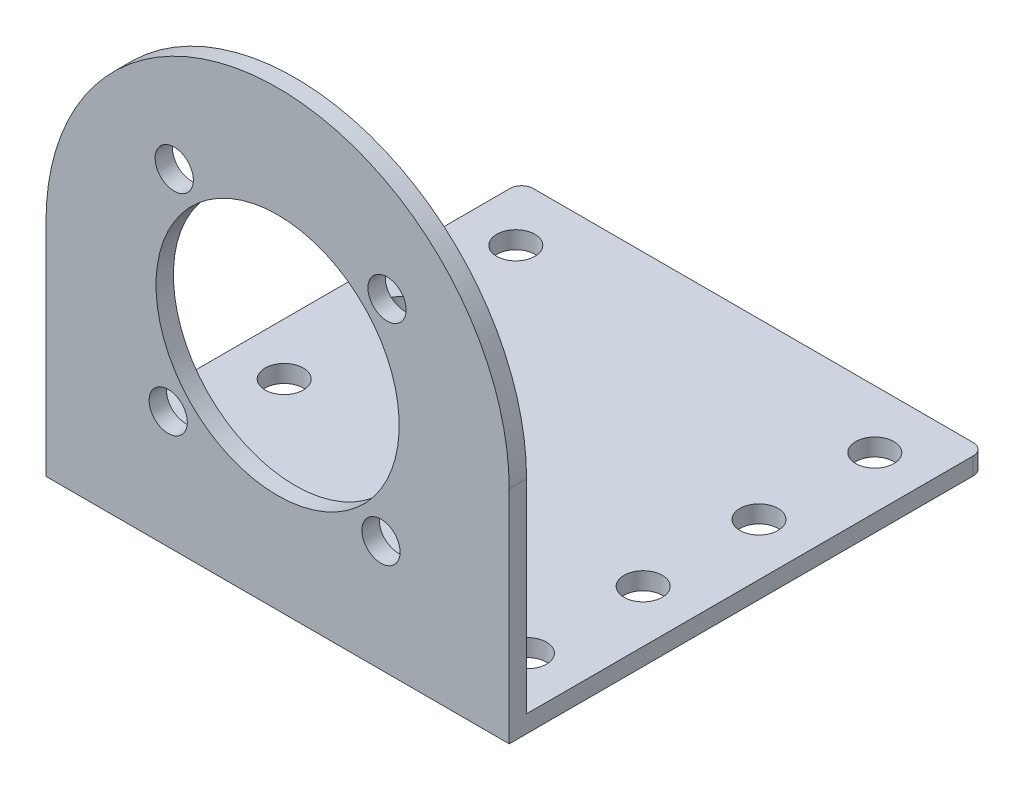
ISO-10303-21;
HEADER;
FILE_DESCRIPTION(('STEP AP214'),'2;1');
FILE_NAME('part.step','',(''),(''),'','','');
FILE_SCHEMA(('AUTOMOTIVE_DESIGN { 1 0 10303 214 1 1 1 1 }'));
ENDSEC;
DATA;
#1=APPLICATION_CONTEXT('core data for automotive mechanical design processes');
#2=APPLICATION_PROTOCOL_DEFINITION('international standard','automotive_design',2000,#1);
#3=PRODUCT_CONTEXT('',#1,'mechanical');
#4=PRODUCT('Part','Part','',(#3));
#5=PRODUCT_RELATED_PRODUCT_CATEGORY('part','',(#4));
#6=PRODUCT_DEFINITION_FORMATION('','',#4);
#7=PRODUCT_DEFINITION_CONTEXT('part definition',#1,'design');
#8=PRODUCT_DEFINITION('design','',#6,#7);
#9=PRODUCT_DEFINITION_SHAPE('','',#8);
#10=(LENGTH_UNIT() NAMED_UNIT(*) SI_UNIT(.MILLI.,.METRE.));
#11=(NAMED_UNIT(*) PLANE_ANGLE_UNIT() SI_UNIT($,.RADIAN.));
#12=(NAMED_UNIT(*) SI_UNIT($,.STERADIAN.) SOLID_ANGLE_UNIT());
#13=UNCERTAINTY_MEASURE_WITH_UNIT(LENGTH_MEASURE(1.E-05),#10,'distance_accuracy_value','');
#14=(GEOMETRIC_REPRESENTATION_CONTEXT(3) GLOBAL_UNCERTAINTY_ASSIGNED_CONTEXT((#13)) GLOBAL_UNIT_ASSIGNED_CONTEXT((#10,
#11,#12)) REPRESENTATION_CONTEXT('',''));
#15=CARTESIAN_POINT('',(0.,0.,0.));
#16=DIRECTION('',(0.,0.,1.));
#17=DIRECTION('',(1.,0.,0.));
#18=AXIS2_PLACEMENT_3D('',#15,#16,#17);
#19=CARTESIAN_POINT('',(40.,36.5355172413793,36.8894084655198));
#20=DIRECTION('',(0.,0.,-1.));
#21=DIRECTION('',(0.,1.,0.));
#22=AXIS2_PLACEMENT_3D('',#19,#20,#21);
#23=PLANE('',#22);
#24=CARTESIAN_POINT('',(29.4484356477115,25.4645185187369,36.8894084655198));
#25=DIRECTION('',(0.,0.,-1.));
#26=DIRECTION('',(0.,1.,0.));
#27=AXIS2_PLACEMENT_3D('',#24,#25,#26);
#28=CIRCLE('',#27,1.65000000000001);
#29=CARTESIAN_POINT('',(29.4484356477115,27.1145185187369,36.8894084655198));
#30=VERTEX_POINT('',#29);
#31=EDGE_CURVE('E643',#30,#30,#28,.T.);
#32=ORIENTED_EDGE('',*,*,#31,.T.);
#33=EDGE_LOOP('',(#32));
#34=FACE_BOUND('',#33,.T.);
#35=CARTESIAN_POINT('',(11.0709987226423,25.9839528890908,36.8894084655198));
#36=DIRECTION('',(0.,0.,-1.));
#37=DIRECTION('',(0.,1.,0.));
#38=AXIS2_PLACEMENT_3D('',#35,#36,#37);
#39=CIRCLE('',#38,1.65);
#40=CARTESIAN_POINT('',(11.0709987226423,27.6339528890908,36.8894084655198));
#41=VERTEX_POINT('',#40);
#42=EDGE_CURVE('E227',#41,#41,#39,.T.);
#43=ORIENTED_EDGE('',*,*,#42,.T.);
#44=EDGE_LOOP('',(#43));
#45=FACE_BOUND('',#44,.T.);
#46=CARTESIAN_POINT('',(10.5515643522885,7.6065159640216,36.8894084655199));
#47=DIRECTION('',(0.,0.,-1.));
#48=DIRECTION('',(0.,1.,0.));
#49=AXIS2_PLACEMENT_3D('',#46,#47,#48);
#50=CIRCLE('',#49,1.64999999999999);
#51=CARTESIAN_POINT('',(10.5515643522885,9.25651596402158,36.8894084655199));
#52=VERTEX_POINT('',#51);
#53=EDGE_CURVE('E299',#52,#52,#50,.T.);
#54=ORIENTED_EDGE('',*,*,#53,.T.);
#55=EDGE_LOOP('',(#54));
#56=FACE_BOUND('',#55,.T.);
#57=CARTESIAN_POINT('',(28.9290012773576,7.08708159366776,36.8894084655199));
#58=DIRECTION('',(0.,0.,-1.));
#59=DIRECTION('',(0.,1.,0.));
#60=AXIS2_PLACEMENT_3D('',#57,#58,#59);
#61=CIRCLE('',#60,1.64999999999999);
#62=CARTESIAN_POINT('',(28.9290012773576,8.73708159366775,36.8894084655199));
#63=VERTEX_POINT('',#62);
#64=EDGE_CURVE('E308',#63,#63,#61,.T.);
#65=ORIENTED_EDGE('',*,*,#64,.T.);
#66=EDGE_LOOP('',(#65));
#67=FACE_BOUND('',#66,.T.);
#68=CARTESIAN_POINT('',(20.,16.5355172413793,36.8894084655199));
#69=DIRECTION('',(0.,0.,-1.));
#70=DIRECTION('',(0.,1.,0.));
#71=AXIS2_PLACEMENT_3D('',#68,#69,#70);
#72=CIRCLE('',#71,10.5);
#73=CARTESIAN_POINT('',(20.,27.0355172413793,36.8894084655199));
#74=VERTEX_POINT('',#73);
#75=EDGE_CURVE('E314',#74,#74,#72,.T.);
#76=ORIENTED_EDGE('',*,*,#75,.T.);
#77=EDGE_LOOP('',(#76));
#78=FACE_BOUND('',#77,.T.);
#79=CARTESIAN_POINT('',(20.,16.5355172413793,36.8894084655199));
#80=DIRECTION('',(0.,0.,-1.));
#81=DIRECTION('',(0.,1.,0.));
#82=AXIS2_PLACEMENT_3D('',#79,#80,#81);
#83=CIRCLE('',#82,20.);
#84=CARTESIAN_POINT('',(40.,16.5355172413793,36.8894084655199));
#85=VERTEX_POINT('',#84);
#86=CARTESIAN_POINT('',(0.,16.5355172413793,36.8894084655199));
#87=VERTEX_POINT('',#86);
#88=EDGE_CURVE('E226',#85,#87,#83,.F.);
#89=ORIENTED_EDGE('',*,*,#88,.T.);
#90=DIRECTION('',(0.,-1.,0.));
#91=VECTOR('',#90,1.);
#92=CARTESIAN_POINT('',(0.,36.5355172413793,36.8894084655198));
#93=LINE('',#92,#91);
#94=CARTESIAN_POINT('',(0.,-2.53448275862069,36.8894084655199));
#95=VERTEX_POINT('',#94);
#96=EDGE_CURVE('E232',#87,#95,#93,.T.);
#97=ORIENTED_EDGE('',*,*,#96,.T.);
#98=DIRECTION('',(-1.,0.,0.));
#99=VECTOR('',#98,1.);
#100=CARTESIAN_POINT('',(40.,-2.53448275862069,36.8894084655199));
#101=LINE('',#100,#99);
#102=CARTESIAN_POINT('',(40.,-2.53448275862069,36.8894084655199));
#103=VERTEX_POINT('',#102);
#104=EDGE_CURVE('E247',#103,#95,#101,.T.);
#105=ORIENTED_EDGE('',*,*,#104,.F.);
#106=DIRECTION('',(0.,-1.,0.));
#107=VECTOR('',#106,1.);
#108=CARTESIAN_POINT('',(40.,36.5355172413793,36.8894084655198));
#109=LINE('',#108,#107);
#110=EDGE_CURVE('E239',#85,#103,#109,.T.);
#111=ORIENTED_EDGE('',*,*,#110,.F.);
#112=EDGE_LOOP('',(#89,#97,#105,#111));
#113=FACE_BOUND('',#112,.T.);
#114=ADVANCED_FACE('F147',(#34,#45,#56,#67,#78,#113),#23,.F.);
#115=CARTESIAN_POINT('',(40.,36.5355172413793,35.3894084655198));
#116=DIRECTION('',(0.,0.,-1.));
#117=DIRECTION('',(0.,1.,0.));
#118=AXIS2_PLACEMENT_3D('',#115,#116,#117);
#119=PLANE('',#118);
#120=CARTESIAN_POINT('',(29.4484356477115,25.4645185187369,35.3894084655198));
#121=DIRECTION('',(0.,0.,-1.));
#122=DIRECTION('',(0.,1.,0.));
#123=AXIS2_PLACEMENT_3D('',#120,#121,#122);
#124=CIRCLE('',#123,1.65000000000001);
#125=CARTESIAN_POINT('',(29.4484356477115,27.1145185187369,35.3894084655198));
#126=VERTEX_POINT('',#125);
#127=EDGE_CURVE('E641',#126,#126,#124,.T.);
#128=ORIENTED_EDGE('',*,*,#127,.F.);
#129=EDGE_LOOP('',(#128));
#130=FACE_BOUND('',#129,.T.);
#131=CARTESIAN_POINT('',(11.0709987226423,25.9839528890908,35.3894084655198));
#132=DIRECTION('',(0.,0.,-1.));
#133=DIRECTION('',(0.,1.,0.));
#134=AXIS2_PLACEMENT_3D('',#131,#132,#133);
#135=CIRCLE('',#134,1.65);
#136=CARTESIAN_POINT('',(11.0709987226423,27.6339528890908,35.3894084655198));
#137=VERTEX_POINT('',#136);
#138=EDGE_CURVE('E644',#137,#137,#135,.T.);
#139=ORIENTED_EDGE('',*,*,#138,.F.);
#140=EDGE_LOOP('',(#139));
#141=FACE_BOUND('',#140,.T.);
#142=CARTESIAN_POINT('',(10.5515643522885,7.6065159640216,35.3894084655198));
#143=DIRECTION('',(0.,0.,-1.));
#144=DIRECTION('',(0.,1.,0.));
#145=AXIS2_PLACEMENT_3D('',#142,#143,#144);
#146=CIRCLE('',#145,1.64999999999999);
#147=CARTESIAN_POINT('',(10.5515643522885,9.25651596402158,35.3894084655198));
#148=VERTEX_POINT('',#147);
#149=EDGE_CURVE('E296',#148,#148,#146,.T.);
#150=ORIENTED_EDGE('',*,*,#149,.F.);
#151=EDGE_LOOP('',(#150));
#152=FACE_BOUND('',#151,.T.);
#153=CARTESIAN_POINT('',(28.9290012773576,7.08708159366776,35.3894084655198));
#154=DIRECTION('',(0.,0.,-1.));
#155=DIRECTION('',(0.,1.,0.));
#156=AXIS2_PLACEMENT_3D('',#153,#154,#155);
#157=CIRCLE('',#156,1.64999999999999);
#158=CARTESIAN_POINT('',(28.9290012773576,8.73708159366775,35.3894084655198));
#159=VERTEX_POINT('',#158);
#160=EDGE_CURVE('E305',#159,#159,#157,.T.);
#161=ORIENTED_EDGE('',*,*,#160,.F.);
#162=EDGE_LOOP('',(#161));
#163=FACE_BOUND('',#162,.T.);
#164=CARTESIAN_POINT('',(20.,16.5355172413793,35.3894084655198));
#165=DIRECTION('',(0.,0.,-1.));
#166=DIRECTION('',(0.,1.,0.));
#167=AXIS2_PLACEMENT_3D('',#164,#165,#166);
#168=CIRCLE('',#167,10.5);
#169=CARTESIAN_POINT('',(20.,27.0355172413793,35.3894084655198));
#170=VERTEX_POINT('',#169);
#171=EDGE_CURVE('E311',#170,#170,#168,.T.);
#172=ORIENTED_EDGE('',*,*,#171,.F.);
#173=EDGE_LOOP('',(#172));
#174=FACE_BOUND('',#173,.T.);
#175=DIRECTION('',(0.,-1.,0.));
#176=VECTOR('',#175,1.);
#177=CARTESIAN_POINT('',(0.,36.5355172413793,35.3894084655198));
#178=LINE('',#177,#176);
#179=CARTESIAN_POINT('',(0.,16.5355172413793,35.3894084655198));
#180=VERTEX_POINT('',#179);
#181=CARTESIAN_POINT('',(0.,-1.03448275862069,35.3894084655198));
#182=VERTEX_POINT('',#181);
#183=EDGE_CURVE('E230',#180,#182,#178,.T.);
#184=ORIENTED_EDGE('',*,*,#183,.F.);
#185=CARTESIAN_POINT('',(20.,16.5355172413793,35.3894084655198));
#186=DIRECTION('',(0.,0.,-1.));
#187=DIRECTION('',(0.,1.,0.));
#188=AXIS2_PLACEMENT_3D('',#185,#186,#187);
#189=CIRCLE('',#188,20.);
#190=CARTESIAN_POINT('',(40.,16.5355172413793,35.3894084655198));
#191=VERTEX_POINT('',#190);
#192=EDGE_CURVE('E216',#191,#180,#189,.F.);
#193=ORIENTED_EDGE('',*,*,#192,.F.);
#194=DIRECTION('',(0.,-1.,0.));
#195=VECTOR('',#194,1.);
#196=CARTESIAN_POINT('',(40.,36.5355172413793,35.3894084655198));
#197=LINE('',#196,#195);
#198=CARTESIAN_POINT('',(40.,-1.03448275862069,35.3894084655198));
#199=VERTEX_POINT('',#198);
#200=EDGE_CURVE('E250',#191,#199,#197,.T.);
#201=ORIENTED_EDGE('',*,*,#200,.T.);
#202=DIRECTION('',(1.,0.,0.));
#203=VECTOR('',#202,1.);
#204=CARTESIAN_POINT('',(40.,-1.03448275862069,35.3894084655198));
#205=LINE('',#204,#203);
#206=EDGE_CURVE('E237',#182,#199,#205,.T.);
#207=ORIENTED_EDGE('',*,*,#206,.F.);
#208=EDGE_LOOP('',(#184,#193,#201,#207));
#209=FACE_BOUND('',#208,.T.);
#210=ADVANCED_FACE('F235',(#130,#141,#152,#163,#174,#209),#119,.T.);
#211=CARTESIAN_POINT('',(0.,0.,0.));
#212=DIRECTION('',(1.,0.,0.));
#213=DIRECTION('',(0.,0.,-1.));
#214=AXIS2_PLACEMENT_3D('',#211,#212,#213);
#215=PLANE('',#214);
#216=DIRECTION('',(0.,0.,-1.));
#217=VECTOR('',#216,1.);
#218=CARTESIAN_POINT('',(0.,-1.03448275862069,36.8894084655199));
#219=LINE('',#218,#217);
#220=CARTESIAN_POINT('',(0.,-1.03448275862069,-3.17959153448014));
#221=VERTEX_POINT('',#220);
#222=EDGE_CURVE('E255',#182,#221,#219,.T.);
#223=ORIENTED_EDGE('',*,*,#222,.T.);
#224=DIRECTION('',(0.,1.,0.));
#225=VECTOR('',#224,1.);
#226=CARTESIAN_POINT('',(0.,0.,-3.17959153448014));
#227=LINE('',#226,#225);
#228=CARTESIAN_POINT('',(0.,-2.53448275862069,-3.17959153448014));
#229=VERTEX_POINT('',#228);
#230=EDGE_CURVE('E170',#221,#229,#227,.F.);
#231=ORIENTED_EDGE('',*,*,#230,.T.);
#232=DIRECTION('',(0.,0.,-1.));
#233=VECTOR('',#232,1.);
#234=CARTESIAN_POINT('',(0.,-2.53448275862069,36.8894084655199));
#235=LINE('',#234,#233);
#236=EDGE_CURVE('E240',#95,#229,#235,.T.);
#237=ORIENTED_EDGE('',*,*,#236,.F.);
#238=ORIENTED_EDGE('',*,*,#96,.F.);
#239=DIRECTION('',(0.,0.,-1.));
#240=VECTOR('',#239,1.);
#241=CARTESIAN_POINT('',(0.,16.5355172413793,75.3894084655198));
#242=LINE('',#241,#240);
#243=EDGE_CURVE('E219',#180,#87,#242,.F.);
#244=ORIENTED_EDGE('',*,*,#243,.F.);
#245=ORIENTED_EDGE('',*,*,#183,.T.);
#246=EDGE_LOOP('',(#223,#231,#237,#238,#244,#245));
#247=FACE_BOUND('',#246,.T.);
#248=ADVANCED_FACE('F229',(#247),#215,.F.);
#249=CARTESIAN_POINT('',(40.,0.,0.));
#250=DIRECTION('',(1.,0.,0.));
#251=DIRECTION('',(0.,0.,-1.));
#252=AXIS2_PLACEMENT_3D('',#249,#250,#251);
#253=PLANE('',#252);
#254=DIRECTION('',(0.,0.,-1.));
#255=VECTOR('',#254,1.);
#256=CARTESIAN_POINT('',(40.,-2.53448275862069,36.8894084655199));
#257=LINE('',#256,#255);
#258=CARTESIAN_POINT('',(40.,-2.53448275862069,-3.17959153448014));
#259=VERTEX_POINT('',#258);
#260=EDGE_CURVE('E242',#103,#259,#257,.T.);
#261=ORIENTED_EDGE('',*,*,#260,.T.);
#262=DIRECTION('',(0.,1.,0.));
#263=VECTOR('',#262,1.);
#264=CARTESIAN_POINT('',(40.,-1.03448275862069,-3.17959153448014));
#265=LINE('',#264,#263);
#266=CARTESIAN_POINT('',(40.,-1.03448275862069,-3.17959153448014));
#267=VERTEX_POINT('',#266);
#268=EDGE_CURVE('E12',#259,#267,#265,.T.);
#269=ORIENTED_EDGE('',*,*,#268,.T.);
#270=DIRECTION('',(0.,0.,-1.));
#271=VECTOR('',#270,1.);
#272=CARTESIAN_POINT('',(40.,-1.03448275862069,36.8894084655199));
#273=LINE('',#272,#271);
#274=EDGE_CURVE('E251',#199,#267,#273,.T.);
#275=ORIENTED_EDGE('',*,*,#274,.F.);
#276=ORIENTED_EDGE('',*,*,#200,.F.);
#277=DIRECTION('',(0.,0.,-1.));
#278=VECTOR('',#277,1.);
#279=CARTESIAN_POINT('',(40.,16.5355172413793,75.3894084655198));
#280=LINE('',#279,#278);
#281=EDGE_CURVE('E222',#191,#85,#280,.F.);
#282=ORIENTED_EDGE('',*,*,#281,.T.);
#283=ORIENTED_EDGE('',*,*,#110,.T.);
#284=EDGE_LOOP('',(#261,#269,#275,#276,#282,#283));
#285=FACE_BOUND('',#284,.T.);
#286=ADVANCED_FACE('F289',(#285),#253,.T.);
#287=CARTESIAN_POINT('',(40.,-2.53448275862069,36.8894084655199));
#288=DIRECTION('',(0.,1.,0.));
#289=DIRECTION('',(0.,0.,1.));
#290=AXIS2_PLACEMENT_3D('',#287,#288,#289);
#291=PLANE('',#290);
#292=CARTESIAN_POINT('',(35.5,-2.53448275862069,0.820408465519859));
#293=DIRECTION('',(0.,1.,0.));
#294=DIRECTION('',(0.,0.,1.));
#295=AXIS2_PLACEMENT_3D('',#292,#293,#294);
#296=CIRCLE('',#295,1.65);
#297=CARTESIAN_POINT('',(35.5,-2.53448275862069,2.47040846551986));
#298=VERTEX_POINT('',#297);
#299=EDGE_CURVE('E320',#298,#298,#296,.T.);
#300=ORIENTED_EDGE('',*,*,#299,.T.);
#301=EDGE_LOOP('',(#300));
#302=FACE_BOUND('',#301,.T.);
#303=CARTESIAN_POINT('',(35.5,-2.53448275862069,10.8204084655199));
#304=DIRECTION('',(0.,1.,0.));
#305=DIRECTION('',(0.,0.,1.));
#306=AXIS2_PLACEMENT_3D('',#303,#304,#305);
#307=CIRCLE('',#306,1.65);
#308=CARTESIAN_POINT('',(35.5,-2.53448275862069,12.4704084655199));
#309=VERTEX_POINT('',#308);
#310=EDGE_CURVE('E326',#309,#309,#307,.T.);
#311=ORIENTED_EDGE('',*,*,#310,.T.);
#312=EDGE_LOOP('',(#311));
#313=FACE_BOUND('',#312,.T.);
#314=CARTESIAN_POINT('',(35.5,-2.53448275862069,20.8204084655199));
#315=DIRECTION('',(0.,1.,0.));
#316=DIRECTION('',(0.,0.,1.));
#317=AXIS2_PLACEMENT_3D('',#314,#315,#316);
#318=CIRCLE('',#317,1.65);
#319=CARTESIAN_POINT('',(35.5,-2.53448275862069,22.4704084655199));
#320=VERTEX_POINT('',#319);
#321=EDGE_CURVE('E332',#320,#320,#318,.T.);
#322=ORIENTED_EDGE('',*,*,#321,.T.);
#323=EDGE_LOOP('',(#322));
#324=FACE_BOUND('',#323,.T.);
#325=CARTESIAN_POINT('',(35.5,-2.53448275862069,30.8204084655199));
#326=DIRECTION('',(0.,1.,0.));
#327=DIRECTION('',(0.,0.,1.));
#328=AXIS2_PLACEMENT_3D('',#325,#326,#327);
#329=CIRCLE('',#328,1.65);
#330=CARTESIAN_POINT('',(35.5,-2.53448275862069,32.4704084655199));
#331=VERTEX_POINT('',#330);
#332=EDGE_CURVE('E338',#331,#331,#329,.T.);
#333=ORIENTED_EDGE('',*,*,#332,.T.);
#334=EDGE_LOOP('',(#333));
#335=FACE_BOUND('',#334,.T.);
#336=CARTESIAN_POINT('',(4.5,-2.53448275862069,0.820408465519859));
#337=DIRECTION('',(0.,1.,0.));
#338=DIRECTION('',(0.,0.,1.));
#339=AXIS2_PLACEMENT_3D('',#336,#337,#338);
#340=CIRCLE('',#339,1.65);
#341=CARTESIAN_POINT('',(4.5,-2.53448275862069,2.47040846551986));
#342=VERTEX_POINT('',#341);
#343=EDGE_CURVE('E344',#342,#342,#340,.T.);
#344=ORIENTED_EDGE('',*,*,#343,.T.);
#345=EDGE_LOOP('',(#344));
#346=FACE_BOUND('',#345,.T.);
#347=CARTESIAN_POINT('',(4.5,-2.53448275862069,10.8204084655199));
#348=DIRECTION('',(0.,1.,0.));
#349=DIRECTION('',(0.,0.,1.));
#350=AXIS2_PLACEMENT_3D('',#347,#348,#349);
#351=CIRCLE('',#350,1.65);
#352=CARTESIAN_POINT('',(4.5,-2.53448275862069,12.4704084655199));
#353=VERTEX_POINT('',#352);
#354=EDGE_CURVE('E350',#353,#353,#351,.T.);
#355=ORIENTED_EDGE('',*,*,#354,.T.);
#356=EDGE_LOOP('',(#355));
#357=FACE_BOUND('',#356,.T.);
#358=CARTESIAN_POINT('',(4.5,-2.53448275862069,20.8204084655199));
#359=DIRECTION('',(0.,1.,0.));
#360=DIRECTION('',(0.,0.,1.));
#361=AXIS2_PLACEMENT_3D('',#358,#359,#360);
#362=CIRCLE('',#361,1.65);
#363=CARTESIAN_POINT('',(4.5,-2.53448275862069,22.4704084655199));
#364=VERTEX_POINT('',#363);
#365=EDGE_CURVE('E356',#364,#364,#362,.T.);
#366=ORIENTED_EDGE('',*,*,#365,.T.);
#367=EDGE_LOOP('',(#366));
#368=FACE_BOUND('',#367,.T.);
#369=CARTESIAN_POINT('',(4.5,-2.53448275862069,30.8204084655199));
#370=DIRECTION('',(0.,1.,0.));
#371=DIRECTION('',(0.,0.,1.));
#372=AXIS2_PLACEMENT_3D('',#369,#370,#371);
#373=CIRCLE('',#372,1.65);
#374=CARTESIAN_POINT('',(4.5,-2.53448275862069,32.4704084655199));
#375=VERTEX_POINT('',#374);
#376=EDGE_CURVE('E257',#375,#375,#373,.T.);
#377=ORIENTED_EDGE('',*,*,#376,.T.);
#378=EDGE_LOOP('',(#377));
#379=FACE_BOUND('',#378,.T.);
#380=ORIENTED_EDGE('',*,*,#236,.T.);
#381=CARTESIAN_POINT('',(1.,-2.53448275862069,-3.17959153448014));
#382=DIRECTION('',(0.,1.,0.));
#383=DIRECTION('',(0.,0.,1.));
#384=AXIS2_PLACEMENT_3D('',#381,#382,#383);
#385=CIRCLE('',#384,1.);
#386=CARTESIAN_POINT('',(1.,-2.53448275862069,-4.17959153448014));
#387=VERTEX_POINT('',#386);
#388=EDGE_CURVE('E155',#229,#387,#385,.F.);
#389=ORIENTED_EDGE('',*,*,#388,.T.);
#390=DIRECTION('',(-1.,0.,0.));
#391=VECTOR('',#390,1.);
#392=CARTESIAN_POINT('',(40.,-2.53448275862069,-4.17959153448014));
#393=LINE('',#392,#391);
#394=CARTESIAN_POINT('',(39.,-2.53448275862069,-4.17959153448014));
#395=VERTEX_POINT('',#394);
#396=EDGE_CURVE('E258',#395,#387,#393,.T.);
#397=ORIENTED_EDGE('',*,*,#396,.F.);
#398=CARTESIAN_POINT('',(39.,-2.53448275862069,-3.17959153448014));
#399=DIRECTION('',(0.,1.,0.));
#400=DIRECTION('',(0.,0.,1.));
#401=AXIS2_PLACEMENT_3D('',#398,#399,#400);
#402=CIRCLE('',#401,1.);
#403=EDGE_CURVE('E162',#395,#259,#402,.F.);
#404=ORIENTED_EDGE('',*,*,#403,.T.);
#405=ORIENTED_EDGE('',*,*,#260,.F.);
#406=ORIENTED_EDGE('',*,*,#104,.T.);
#407=EDGE_LOOP('',(#380,#389,#397,#404,#405,#406));
#408=FACE_BOUND('',#407,.T.);
#409=ADVANCED_FACE('F275',(#302,#313,#324,#335,#346,#357,#368,#379,#408),#291,.F.);
#410=CARTESIAN_POINT('',(40.,-2.53448275862069,-4.17959153448014));
#411=DIRECTION('',(0.,0.,1.));
#412=DIRECTION('',(1.,0.,0.));
#413=AXIS2_PLACEMENT_3D('',#410,#411,#412);
#414=PLANE('',#413);
#415=ORIENTED_EDGE('',*,*,#396,.T.);
#416=DIRECTION('',(0.,1.,0.));
#417=VECTOR('',#416,1.);
#418=CARTESIAN_POINT('',(1.,-2.53448275862069,-4.17959153448014));
#419=LINE('',#418,#417);
#420=CARTESIAN_POINT('',(1.,-1.03448275862069,-4.17959153448014));
#421=VERTEX_POINT('',#420);
#422=EDGE_CURVE('E266',#387,#421,#419,.T.);
#423=ORIENTED_EDGE('',*,*,#422,.T.);
#424=DIRECTION('',(-1.,0.,0.));
#425=VECTOR('',#424,1.);
#426=CARTESIAN_POINT('',(40.,-1.03448275862069,-4.17959153448014));
#427=LINE('',#426,#425);
#428=CARTESIAN_POINT('',(39.,-1.03448275862069,-4.17959153448014));
#429=VERTEX_POINT('',#428);
#430=EDGE_CURVE('E254',#429,#421,#427,.T.);
#431=ORIENTED_EDGE('',*,*,#430,.F.);
#432=DIRECTION('',(0.,1.,0.));
#433=VECTOR('',#432,1.);
#434=CARTESIAN_POINT('',(39.,-2.53448275862069,-4.17959153448014));
#435=LINE('',#434,#433);
#436=EDGE_CURVE('E233',#429,#395,#435,.F.);
#437=ORIENTED_EDGE('',*,*,#436,.T.);
#438=EDGE_LOOP('',(#415,#423,#431,#437));
#439=FACE_BOUND('',#438,.T.);
#440=ADVANCED_FACE('F279',(#439),#414,.F.);
#441=CARTESIAN_POINT('',(40.,-1.03448275862069,36.8894084655199));
#442=DIRECTION('',(0.,1.,0.));
#443=DIRECTION('',(0.,0.,1.));
#444=AXIS2_PLACEMENT_3D('',#441,#442,#443);
#445=PLANE('',#444);
#446=CARTESIAN_POINT('',(35.5,-1.03448275862069,0.820408465519859));
#447=DIRECTION('',(0.,1.,0.));
#448=DIRECTION('',(0.,0.,1.));
#449=AXIS2_PLACEMENT_3D('',#446,#447,#448);
#450=CIRCLE('',#449,1.65);
#451=CARTESIAN_POINT('',(35.5,-1.03448275862069,2.47040846551986));
#452=VERTEX_POINT('',#451);
#453=EDGE_CURVE('E317',#452,#452,#450,.T.);
#454=ORIENTED_EDGE('',*,*,#453,.F.);
#455=EDGE_LOOP('',(#454));
#456=FACE_BOUND('',#455,.T.);
#457=CARTESIAN_POINT('',(35.5,-1.03448275862069,10.8204084655199));
#458=DIRECTION('',(0.,1.,0.));
#459=DIRECTION('',(0.,0.,1.));
#460=AXIS2_PLACEMENT_3D('',#457,#458,#459);
#461=CIRCLE('',#460,1.65);
#462=CARTESIAN_POINT('',(35.5,-1.03448275862069,12.4704084655199));
#463=VERTEX_POINT('',#462);
#464=EDGE_CURVE('E323',#463,#463,#461,.T.);
#465=ORIENTED_EDGE('',*,*,#464,.F.);
#466=EDGE_LOOP('',(#465));
#467=FACE_BOUND('',#466,.T.);
#468=CARTESIAN_POINT('',(35.5,-1.03448275862069,20.8204084655199));
#469=DIRECTION('',(0.,1.,0.));
#470=DIRECTION('',(0.,0.,1.));
#471=AXIS2_PLACEMENT_3D('',#468,#469,#470);
#472=CIRCLE('',#471,1.65);
#473=CARTESIAN_POINT('',(35.5,-1.03448275862069,22.4704084655199));
#474=VERTEX_POINT('',#473);
#475=EDGE_CURVE('E329',#474,#474,#472,.T.);
#476=ORIENTED_EDGE('',*,*,#475,.F.);
#477=EDGE_LOOP('',(#476));
#478=FACE_BOUND('',#477,.T.);
#479=CARTESIAN_POINT('',(35.5,-1.03448275862069,30.8204084655199));
#480=DIRECTION('',(0.,1.,0.));
#481=DIRECTION('',(0.,0.,1.));
#482=AXIS2_PLACEMENT_3D('',#479,#480,#481);
#483=CIRCLE('',#482,1.65);
#484=CARTESIAN_POINT('',(35.5,-1.03448275862069,32.4704084655199));
#485=VERTEX_POINT('',#484);
#486=EDGE_CURVE('E335',#485,#485,#483,.T.);
#487=ORIENTED_EDGE('',*,*,#486,.F.);
#488=EDGE_LOOP('',(#487));
#489=FACE_BOUND('',#488,.T.);
#490=CARTESIAN_POINT('',(4.5,-1.03448275862069,0.820408465519859));
#491=DIRECTION('',(0.,1.,0.));
#492=DIRECTION('',(0.,0.,1.));
#493=AXIS2_PLACEMENT_3D('',#490,#491,#492);
#494=CIRCLE('',#493,1.65);
#495=CARTESIAN_POINT('',(4.5,-1.03448275862069,2.47040846551986));
#496=VERTEX_POINT('',#495);
#497=EDGE_CURVE('E341',#496,#496,#494,.T.);
#498=ORIENTED_EDGE('',*,*,#497,.F.);
#499=EDGE_LOOP('',(#498));
#500=FACE_BOUND('',#499,.T.);
#501=CARTESIAN_POINT('',(4.5,-1.03448275862069,10.8204084655199));
#502=DIRECTION('',(0.,1.,0.));
#503=DIRECTION('',(0.,0.,1.));
#504=AXIS2_PLACEMENT_3D('',#501,#502,#503);
#505=CIRCLE('',#504,1.65);
#506=CARTESIAN_POINT('',(4.5,-1.03448275862069,12.4704084655199));
#507=VERTEX_POINT('',#506);
#508=EDGE_CURVE('E347',#507,#507,#505,.T.);
#509=ORIENTED_EDGE('',*,*,#508,.F.);
#510=EDGE_LOOP('',(#509));
#511=FACE_BOUND('',#510,.T.);
#512=CARTESIAN_POINT('',(4.5,-1.03448275862069,20.8204084655199));
#513=DIRECTION('',(0.,1.,0.));
#514=DIRECTION('',(0.,0.,1.));
#515=AXIS2_PLACEMENT_3D('',#512,#513,#514);
#516=CIRCLE('',#515,1.65);
#517=CARTESIAN_POINT('',(4.5,-1.03448275862069,22.4704084655199));
#518=VERTEX_POINT('',#517);
#519=EDGE_CURVE('E353',#518,#518,#516,.T.);
#520=ORIENTED_EDGE('',*,*,#519,.F.);
#521=EDGE_LOOP('',(#520));
#522=FACE_BOUND('',#521,.T.);
#523=CARTESIAN_POINT('',(4.5,-1.03448275862069,30.8204084655199));
#524=DIRECTION('',(0.,1.,0.));
#525=DIRECTION('',(0.,0.,1.));
#526=AXIS2_PLACEMENT_3D('',#523,#524,#525);
#527=CIRCLE('',#526,1.65);
#528=CARTESIAN_POINT('',(4.5,-1.03448275862069,32.4704084655199));
#529=VERTEX_POINT('',#528);
#530=EDGE_CURVE('E359',#529,#529,#527,.T.);
#531=ORIENTED_EDGE('',*,*,#530,.F.);
#532=EDGE_LOOP('',(#531));
#533=FACE_BOUND('',#532,.T.);
#534=ORIENTED_EDGE('',*,*,#430,.T.);
#535=CARTESIAN_POINT('',(1.,-1.03448275862069,-3.17959153448014));
#536=DIRECTION('',(0.,1.,0.));
#537=DIRECTION('',(0.,0.,1.));
#538=AXIS2_PLACEMENT_3D('',#535,#536,#537);
#539=CIRCLE('',#538,1.);
#540=EDGE_CURVE('E271',#421,#221,#539,.T.);
#541=ORIENTED_EDGE('',*,*,#540,.T.);
#542=ORIENTED_EDGE('',*,*,#222,.F.);
#543=ORIENTED_EDGE('',*,*,#206,.T.);
#544=ORIENTED_EDGE('',*,*,#274,.T.);
#545=CARTESIAN_POINT('',(39.,-1.03448275862069,-3.17959153448014));
#546=DIRECTION('',(0.,1.,0.));
#547=DIRECTION('',(0.,0.,1.));
#548=AXIS2_PLACEMENT_3D('',#545,#546,#547);
#549=CIRCLE('',#548,1.);
#550=EDGE_CURVE('E269',#267,#429,#549,.T.);
#551=ORIENTED_EDGE('',*,*,#550,.T.);
#552=EDGE_LOOP('',(#534,#541,#542,#543,#544,#551));
#553=FACE_BOUND('',#552,.T.);
#554=ADVANCED_FACE('F284',(#456,#467,#478,#489,#500,#511,#522,#533,#553),#445,.T.);
#555=CARTESIAN_POINT('',(4.5,-41.0344827586207,30.8204084655199));
#556=DIRECTION('',(0.,1.,0.));
#557=DIRECTION('',(0.,0.,1.));
#558=AXIS2_PLACEMENT_3D('',#555,#556,#557);
#559=CYLINDRICAL_SURFACE('',#558,1.65);
#560=ORIENTED_EDGE('',*,*,#530,.T.);
#561=EDGE_LOOP('',(#560));
#562=FACE_BOUND('',#561,.T.);
#563=ORIENTED_EDGE('',*,*,#376,.F.);
#564=EDGE_LOOP('',(#563));
#565=FACE_BOUND('',#564,.T.);
#566=ADVANCED_FACE('F365',(#562,#565),#559,.F.);
#567=CARTESIAN_POINT('',(4.5,-41.0344827586207,20.8204084655199));
#568=DIRECTION('',(0.,1.,0.));
#569=DIRECTION('',(0.,0.,1.));
#570=AXIS2_PLACEMENT_3D('',#567,#568,#569);
#571=CYLINDRICAL_SURFACE('',#570,1.65);
#572=ORIENTED_EDGE('',*,*,#519,.T.);
#573=EDGE_LOOP('',(#572));
#574=FACE_BOUND('',#573,.T.);
#575=ORIENTED_EDGE('',*,*,#365,.F.);
#576=EDGE_LOOP('',(#575));
#577=FACE_BOUND('',#576,.T.);
#578=ADVANCED_FACE('F367',(#574,#577),#571,.F.);
#579=CARTESIAN_POINT('',(4.5,-41.0344827586207,10.8204084655199));
#580=DIRECTION('',(0.,1.,0.));
#581=DIRECTION('',(0.,0.,1.));
#582=AXIS2_PLACEMENT_3D('',#579,#580,#581);
#583=CYLINDRICAL_SURFACE('',#582,1.65);
#584=ORIENTED_EDGE('',*,*,#508,.T.);
#585=EDGE_LOOP('',(#584));
#586=FACE_BOUND('',#585,.T.);
#587=ORIENTED_EDGE('',*,*,#354,.F.);
#588=EDGE_LOOP('',(#587));
#589=FACE_BOUND('',#588,.T.);
#590=ADVANCED_FACE('F374',(#586,#589),#583,.F.);
#591=CARTESIAN_POINT('',(4.5,-41.0344827586207,0.820408465519859));
#592=DIRECTION('',(0.,1.,0.));
#593=DIRECTION('',(0.,0.,1.));
#594=AXIS2_PLACEMENT_3D('',#591,#592,#593);
#595=CYLINDRICAL_SURFACE('',#594,1.65);
#596=ORIENTED_EDGE('',*,*,#497,.T.);
#597=EDGE_LOOP('',(#596));
#598=FACE_BOUND('',#597,.T.);
#599=ORIENTED_EDGE('',*,*,#343,.F.);
#600=EDGE_LOOP('',(#599));
#601=FACE_BOUND('',#600,.T.);
#602=ADVANCED_FACE('F439',(#598,#601),#595,.F.);
#603=CARTESIAN_POINT('',(35.5,-41.0344827586207,30.8204084655199));
#604=DIRECTION('',(0.,1.,0.));
#605=DIRECTION('',(0.,0.,1.));
#606=AXIS2_PLACEMENT_3D('',#603,#604,#605);
#607=CYLINDRICAL_SURFACE('',#606,1.65);
#608=ORIENTED_EDGE('',*,*,#486,.T.);
#609=EDGE_LOOP('',(#608));
#610=FACE_BOUND('',#609,.T.);
#611=ORIENTED_EDGE('',*,*,#332,.F.);
#612=EDGE_LOOP('',(#611));
#613=FACE_BOUND('',#612,.T.);
#614=ADVANCED_FACE('F435',(#610,#613),#607,.F.);
#615=CARTESIAN_POINT('',(35.5,-41.0344827586207,20.8204084655199));
#616=DIRECTION('',(0.,1.,0.));
#617=DIRECTION('',(0.,0.,1.));
#618=AXIS2_PLACEMENT_3D('',#615,#616,#617);
#619=CYLINDRICAL_SURFACE('',#618,1.65);
#620=ORIENTED_EDGE('',*,*,#475,.T.);
#621=EDGE_LOOP('',(#620));
#622=FACE_BOUND('',#621,.T.);
#623=ORIENTED_EDGE('',*,*,#321,.F.);
#624=EDGE_LOOP('',(#623));
#625=FACE_BOUND('',#624,.T.);
#626=ADVANCED_FACE('F431',(#622,#625),#619,.F.);
#627=CARTESIAN_POINT('',(35.5,-41.0344827586207,10.8204084655199));
#628=DIRECTION('',(0.,1.,0.));
#629=DIRECTION('',(0.,0.,1.));
#630=AXIS2_PLACEMENT_3D('',#627,#628,#629);
#631=CYLINDRICAL_SURFACE('',#630,1.65);
#632=ORIENTED_EDGE('',*,*,#464,.T.);
#633=EDGE_LOOP('',(#632));
#634=FACE_BOUND('',#633,.T.);
#635=ORIENTED_EDGE('',*,*,#310,.F.);
#636=EDGE_LOOP('',(#635));
#637=FACE_BOUND('',#636,.T.);
#638=ADVANCED_FACE('F427',(#634,#637),#631,.F.);
#639=CARTESIAN_POINT('',(35.5,-41.0344827586207,0.820408465519859));
#640=DIRECTION('',(0.,1.,0.));
#641=DIRECTION('',(0.,0.,1.));
#642=AXIS2_PLACEMENT_3D('',#639,#640,#641);
#643=CYLINDRICAL_SURFACE('',#642,1.65);
#644=ORIENTED_EDGE('',*,*,#453,.T.);
#645=EDGE_LOOP('',(#644));
#646=FACE_BOUND('',#645,.T.);
#647=ORIENTED_EDGE('',*,*,#299,.F.);
#648=EDGE_LOOP('',(#647));
#649=FACE_BOUND('',#648,.T.);
#650=ADVANCED_FACE('F423',(#646,#649),#643,.F.);
#651=CARTESIAN_POINT('',(20.,16.5355172413793,75.3894084655198));
#652=DIRECTION('',(0.,0.,-1.));
#653=DIRECTION('',(0.,1.,0.));
#654=AXIS2_PLACEMENT_3D('',#651,#652,#653);
#655=CYLINDRICAL_SURFACE('',#654,10.5);
#656=ORIENTED_EDGE('',*,*,#171,.T.);
#657=EDGE_LOOP('',(#656));
#658=FACE_BOUND('',#657,.T.);
#659=ORIENTED_EDGE('',*,*,#75,.F.);
#660=EDGE_LOOP('',(#659));
#661=FACE_BOUND('',#660,.T.);
#662=ADVANCED_FACE('F419',(#658,#661),#655,.F.);
#663=CARTESIAN_POINT('',(28.9290012773576,7.08708159366775,75.3894084655198));
#664=DIRECTION('',(0.,0.,-1.));
#665=DIRECTION('',(0.,1.,0.));
#666=AXIS2_PLACEMENT_3D('',#663,#664,#665);
#667=CYLINDRICAL_SURFACE('',#666,1.64999999999999);
#668=ORIENTED_EDGE('',*,*,#160,.T.);
#669=EDGE_LOOP('',(#668));
#670=FACE_BOUND('',#669,.T.);
#671=ORIENTED_EDGE('',*,*,#64,.F.);
#672=EDGE_LOOP('',(#671));
#673=FACE_BOUND('',#672,.T.);
#674=ADVANCED_FACE('F415',(#670,#673),#667,.F.);
#675=CARTESIAN_POINT('',(10.5515643522885,7.60651596402159,75.3894084655198));
#676=DIRECTION('',(0.,0.,-1.));
#677=DIRECTION('',(0.,1.,0.));
#678=AXIS2_PLACEMENT_3D('',#675,#676,#677);
#679=CYLINDRICAL_SURFACE('',#678,1.64999999999999);
#680=ORIENTED_EDGE('',*,*,#149,.T.);
#681=EDGE_LOOP('',(#680));
#682=FACE_BOUND('',#681,.T.);
#683=ORIENTED_EDGE('',*,*,#53,.F.);
#684=EDGE_LOOP('',(#683));
#685=FACE_BOUND('',#684,.T.);
#686=ADVANCED_FACE('F412',(#682,#685),#679,.F.);
#687=CARTESIAN_POINT('',(20.,16.5355172413793,75.3894084655198));
#688=DIRECTION('',(0.,0.,-1.));
#689=DIRECTION('',(0.,1.,0.));
#690=AXIS2_PLACEMENT_3D('',#687,#688,#689);
#691=CYLINDRICAL_SURFACE('',#690,20.);
#692=ORIENTED_EDGE('',*,*,#281,.F.);
#693=ORIENTED_EDGE('',*,*,#192,.T.);
#694=ORIENTED_EDGE('',*,*,#243,.T.);
#695=ORIENTED_EDGE('',*,*,#88,.F.);
#696=EDGE_LOOP('',(#692,#693,#694,#695));
#697=FACE_BOUND('',#696,.T.);
#698=ADVANCED_FACE('F218',(#697),#691,.T.);
#699=CARTESIAN_POINT('',(11.0709987226423,25.9839528890908,75.3894084655198));
#700=DIRECTION('',(0.,0.,-1.));
#701=DIRECTION('',(0.,1.,0.));
#702=AXIS2_PLACEMENT_3D('',#699,#700,#701);
#703=CYLINDRICAL_SURFACE('',#702,1.65);
#704=ORIENTED_EDGE('',*,*,#138,.T.);
#705=EDGE_LOOP('',(#704));
#706=FACE_BOUND('',#705,.T.);
#707=ORIENTED_EDGE('',*,*,#42,.F.);
#708=EDGE_LOOP('',(#707));
#709=FACE_BOUND('',#708,.T.);
#710=ADVANCED_FACE('F399',(#706,#709),#703,.F.);
#711=CARTESIAN_POINT('',(29.4484356477115,25.4645185187369,75.3894084655198));
#712=DIRECTION('',(0.,0.,-1.));
#713=DIRECTION('',(0.,1.,0.));
#714=AXIS2_PLACEMENT_3D('',#711,#712,#713);
#715=CYLINDRICAL_SURFACE('',#714,1.65000000000001);
#716=ORIENTED_EDGE('',*,*,#127,.T.);
#717=EDGE_LOOP('',(#716));
#718=FACE_BOUND('',#717,.T.);
#719=ORIENTED_EDGE('',*,*,#31,.F.);
#720=EDGE_LOOP('',(#719));
#721=FACE_BOUND('',#720,.T.);
#722=ADVANCED_FACE('F394',(#718,#721),#715,.F.);
#723=CARTESIAN_POINT('',(1.,-2.53448275862069,-3.17959153448014));
#724=DIRECTION('',(0.,1.,0.));
#725=DIRECTION('',(0.,0.,1.));
#726=AXIS2_PLACEMENT_3D('',#723,#724,#725);
#727=CYLINDRICAL_SURFACE('',#726,1.);
#728=ORIENTED_EDGE('',*,*,#388,.F.);
#729=ORIENTED_EDGE('',*,*,#230,.F.);
#730=ORIENTED_EDGE('',*,*,#540,.F.);
#731=ORIENTED_EDGE('',*,*,#422,.F.);
#732=EDGE_LOOP('',(#728,#729,#730,#731));
#733=FACE_BOUND('',#732,.T.);
#734=ADVANCED_FACE('F282',(#733),#727,.T.);
#735=CARTESIAN_POINT('',(39.,0.,-3.17959153448014));
#736=DIRECTION('',(0.,-1.,0.));
#737=DIRECTION('',(0.,0.,-1.));
#738=AXIS2_PLACEMENT_3D('',#735,#736,#737);
#739=CYLINDRICAL_SURFACE('',#738,1.);
#740=ORIENTED_EDGE('',*,*,#403,.F.);
#741=ORIENTED_EDGE('',*,*,#436,.F.);
#742=ORIENTED_EDGE('',*,*,#550,.F.);
#743=ORIENTED_EDGE('',*,*,#268,.F.);
#744=EDGE_LOOP('',(#740,#741,#742,#743));
#745=FACE_BOUND('',#744,.T.);
#746=ADVANCED_FACE('F149',(#745),#739,.T.);
#747=CLOSED_SHELL('',(#114,#210,#248,#286,#409,#440,#554,#566,#578,#590,#602,#614,#626,#638,
#650,#662,#674,#686,#698,#710,#722,#734,#746));
#748=MANIFOLD_SOLID_BREP('B2',#747);
#749=ADVANCED_BREP_SHAPE_REPRESENTATION('',(#18,#748),#14);
#750=SHAPE_DEFINITION_REPRESENTATION(#9,#749);
ENDSEC;
END-ISO-10303-21;
